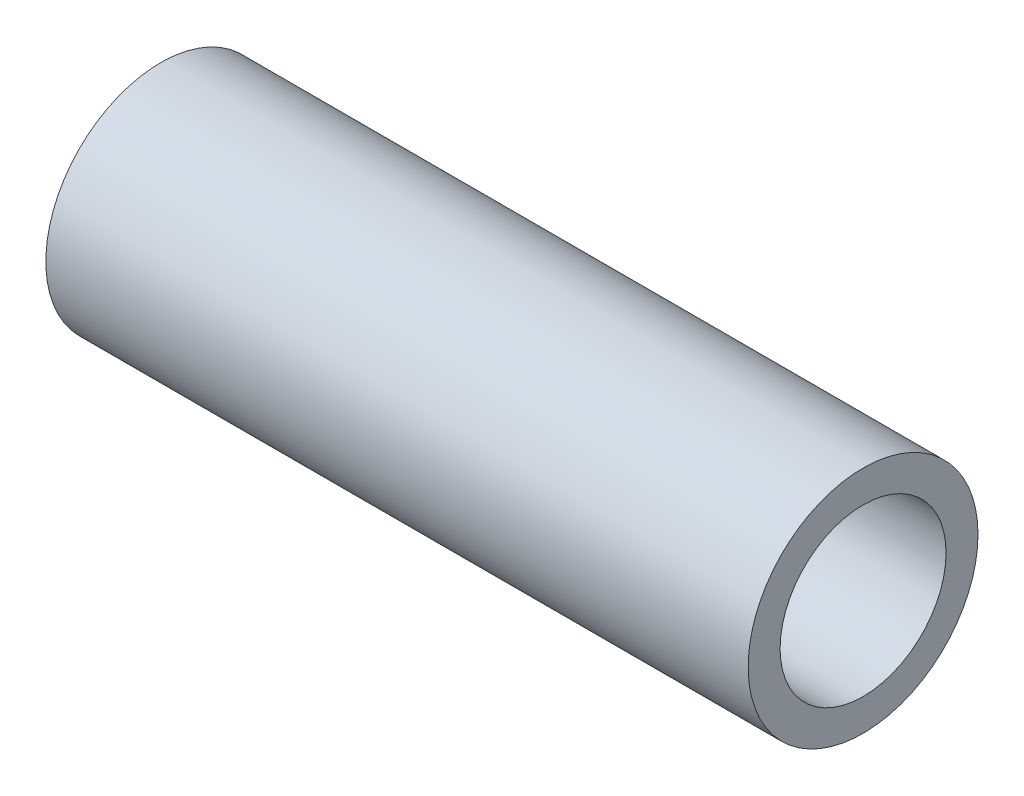
ISO-10303-21;
HEADER;
FILE_DESCRIPTION(('STEP AP214'),'2;1');
FILE_NAME('part.step','',(''),(''),'','','');
FILE_SCHEMA(('AUTOMOTIVE_DESIGN { 1 0 10303 214 1 1 1 1 }'));
ENDSEC;
DATA;
#1=APPLICATION_CONTEXT('core data for automotive mechanical design processes');
#2=APPLICATION_PROTOCOL_DEFINITION('international standard','automotive_design',2000,#1);
#3=PRODUCT_CONTEXT('',#1,'mechanical');
#4=PRODUCT('Part','Part','',(#3));
#5=PRODUCT_RELATED_PRODUCT_CATEGORY('part','',(#4));
#6=PRODUCT_DEFINITION_FORMATION('','',#4);
#7=PRODUCT_DEFINITION_CONTEXT('part definition',#1,'design');
#8=PRODUCT_DEFINITION('design','',#6,#7);
#9=PRODUCT_DEFINITION_SHAPE('','',#8);
#10=(LENGTH_UNIT() NAMED_UNIT(*) SI_UNIT(.MILLI.,.METRE.));
#11=(NAMED_UNIT(*) PLANE_ANGLE_UNIT() SI_UNIT($,.RADIAN.));
#12=(NAMED_UNIT(*) SI_UNIT($,.STERADIAN.) SOLID_ANGLE_UNIT());
#13=UNCERTAINTY_MEASURE_WITH_UNIT(LENGTH_MEASURE(1.E-05),#10,'distance_accuracy_value','');
#14=(GEOMETRIC_REPRESENTATION_CONTEXT(3) GLOBAL_UNCERTAINTY_ASSIGNED_CONTEXT((#13)) GLOBAL_UNIT_ASSIGNED_CONTEXT((#10,
#11,#12)) REPRESENTATION_CONTEXT('',''));
#15=CARTESIAN_POINT('',(0.,0.,0.));
#16=DIRECTION('',(0.,0.,1.));
#17=DIRECTION('',(1.,0.,0.));
#18=AXIS2_PLACEMENT_3D('',#15,#16,#17);
#19=CARTESIAN_POINT('',(27.5,0.,0.));
#20=DIRECTION('',(1.,0.,0.));
#21=DIRECTION('',(0.,0.,-1.));
#22=AXIS2_PLACEMENT_3D('',#19,#20,#21);
#23=PLANE('',#22);
#24=CARTESIAN_POINT('',(27.5,0.,0.));
#25=DIRECTION('',(1.,0.,0.));
#26=DIRECTION('',(0.,0.,-1.));
#27=AXIS2_PLACEMENT_3D('',#24,#25,#26);
#28=CIRCLE('',#27,9.);
#29=CARTESIAN_POINT('',(27.5,0.,-9.));
#30=VERTEX_POINT('',#29);
#31=EDGE_CURVE('E10',#30,#30,#28,.T.);
#32=ORIENTED_EDGE('',*,*,#31,.T.);
#33=EDGE_LOOP('',(#32));
#34=FACE_BOUND('',#33,.T.);
#35=CARTESIAN_POINT('',(27.5,0.,0.));
#36=DIRECTION('',(1.,0.,0.));
#37=DIRECTION('',(0.,0.,-1.));
#38=AXIS2_PLACEMENT_3D('',#35,#36,#37);
#39=CIRCLE('',#38,6.5);
#40=CARTESIAN_POINT('',(27.5,0.,-6.5));
#41=VERTEX_POINT('',#40);
#42=EDGE_CURVE('E44',#41,#41,#39,.T.);
#43=ORIENTED_EDGE('',*,*,#42,.F.);
#44=EDGE_LOOP('',(#43));
#45=FACE_BOUND('',#44,.T.);
#46=ADVANCED_FACE('F33',(#34,#45),#23,.T.);
#47=CARTESIAN_POINT('',(-27.5,0.,0.));
#48=DIRECTION('',(1.,0.,0.));
#49=DIRECTION('',(0.,0.,-1.));
#50=AXIS2_PLACEMENT_3D('',#47,#48,#49);
#51=PLANE('',#50);
#52=CARTESIAN_POINT('',(-27.5,0.,0.));
#53=DIRECTION('',(1.,0.,0.));
#54=DIRECTION('',(0.,0.,-1.));
#55=AXIS2_PLACEMENT_3D('',#52,#53,#54);
#56=CIRCLE('',#55,9.);
#57=CARTESIAN_POINT('',(-27.5,0.,-9.));
#58=VERTEX_POINT('',#57);
#59=EDGE_CURVE('E37',#58,#58,#56,.T.);
#60=ORIENTED_EDGE('',*,*,#59,.F.);
#61=EDGE_LOOP('',(#60));
#62=FACE_BOUND('',#61,.T.);
#63=CARTESIAN_POINT('',(-27.5,0.,0.));
#64=DIRECTION('',(1.,0.,0.));
#65=DIRECTION('',(0.,0.,-1.));
#66=AXIS2_PLACEMENT_3D('',#63,#64,#65);
#67=CIRCLE('',#66,6.5);
#68=CARTESIAN_POINT('',(-27.5,0.,-6.5));
#69=VERTEX_POINT('',#68);
#70=EDGE_CURVE('E46',#69,#69,#67,.T.);
#71=ORIENTED_EDGE('',*,*,#70,.T.);
#72=EDGE_LOOP('',(#71));
#73=FACE_BOUND('',#72,.T.);
#74=ADVANCED_FACE('F56',(#62,#73),#51,.F.);
#75=CARTESIAN_POINT('',(27.5,0.,0.));
#76=DIRECTION('',(-1.,0.,0.));
#77=DIRECTION('',(0.,0.,1.));
#78=AXIS2_PLACEMENT_3D('',#75,#76,#77);
#79=CYLINDRICAL_SURFACE('',#78,9.);
#80=ORIENTED_EDGE('',*,*,#31,.F.);
#81=EDGE_LOOP('',(#80));
#82=FACE_BOUND('',#81,.T.);
#83=ORIENTED_EDGE('',*,*,#59,.T.);
#84=EDGE_LOOP('',(#83));
#85=FACE_BOUND('',#84,.T.);
#86=ADVANCED_FACE('F35',(#82,#85),#79,.T.);
#87=CARTESIAN_POINT('',(27.5,0.,0.));
#88=DIRECTION('',(-1.,0.,0.));
#89=DIRECTION('',(0.,0.,1.));
#90=AXIS2_PLACEMENT_3D('',#87,#88,#89);
#91=CYLINDRICAL_SURFACE('',#90,6.5);
#92=ORIENTED_EDGE('',*,*,#42,.T.);
#93=EDGE_LOOP('',(#92));
#94=FACE_BOUND('',#93,.T.);
#95=ORIENTED_EDGE('',*,*,#70,.F.);
#96=EDGE_LOOP('',(#95));
#97=FACE_BOUND('',#96,.T.);
#98=ADVANCED_FACE('F52',(#94,#97),#91,.F.);
#99=CLOSED_SHELL('',(#46,#74,#86,#98));
#100=MANIFOLD_SOLID_BREP('B2',#99);
#101=ADVANCED_BREP_SHAPE_REPRESENTATION('',(#18,#100),#14);
#102=SHAPE_DEFINITION_REPRESENTATION(#9,#101);
ENDSEC;
END-ISO-10303-21;
